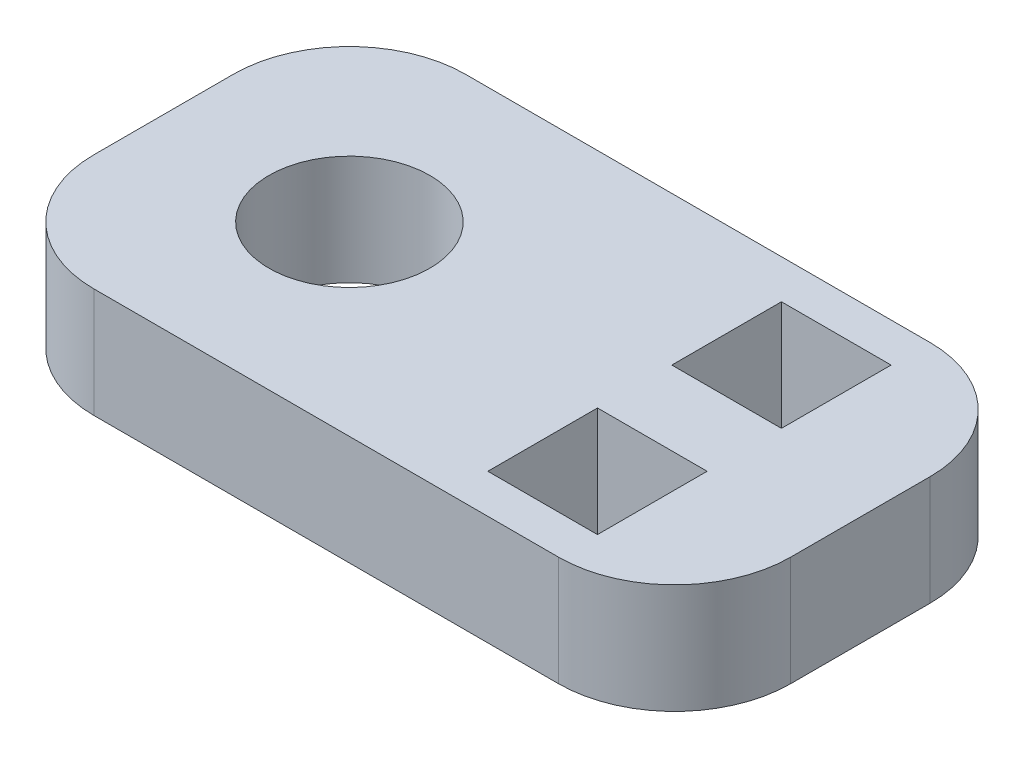
ISO-10303-21;
HEADER;
FILE_DESCRIPTION(('STEP AP214'),'2;1');
FILE_NAME('part.step','',(''),(''),'','','');
FILE_SCHEMA(('AUTOMOTIVE_DESIGN { 1 0 10303 214 1 1 1 1 }'));
ENDSEC;
DATA;
#1=APPLICATION_CONTEXT('core data for automotive mechanical design processes');
#2=APPLICATION_PROTOCOL_DEFINITION('international standard','automotive_design',2000,#1);
#3=PRODUCT_CONTEXT('',#1,'mechanical');
#4=PRODUCT('Part','Part','',(#3));
#5=PRODUCT_RELATED_PRODUCT_CATEGORY('part','',(#4));
#6=PRODUCT_DEFINITION_FORMATION('','',#4);
#7=PRODUCT_DEFINITION_CONTEXT('part definition',#1,'design');
#8=PRODUCT_DEFINITION('design','',#6,#7);
#9=PRODUCT_DEFINITION_SHAPE('','',#8);
#10=(LENGTH_UNIT() NAMED_UNIT(*) SI_UNIT(.MILLI.,.METRE.));
#11=(NAMED_UNIT(*) PLANE_ANGLE_UNIT() SI_UNIT($,.RADIAN.));
#12=(NAMED_UNIT(*) SI_UNIT($,.STERADIAN.) SOLID_ANGLE_UNIT());
#13=UNCERTAINTY_MEASURE_WITH_UNIT(LENGTH_MEASURE(1.E-05),#10,'distance_accuracy_value','');
#14=(GEOMETRIC_REPRESENTATION_CONTEXT(3) GLOBAL_UNCERTAINTY_ASSIGNED_CONTEXT((#13)) GLOBAL_UNIT_ASSIGNED_CONTEXT((#10,
#11,#12)) REPRESENTATION_CONTEXT('',''));
#15=CARTESIAN_POINT('',(0.,0.,0.));
#16=DIRECTION('',(0.,0.,1.));
#17=DIRECTION('',(1.,0.,0.));
#18=AXIS2_PLACEMENT_3D('',#15,#16,#17);
#19=CARTESIAN_POINT('',(0.,2.9972,-10.16));
#20=DIRECTION('',(0.,-1.,0.));
#21=DIRECTION('',(0.,0.,-1.));
#22=AXIS2_PLACEMENT_3D('',#19,#20,#21);
#23=PLANE('',#22);
#24=DIRECTION('',(0.,0.,1.));
#25=VECTOR('',#24,1.);
#26=CARTESIAN_POINT('',(12.8778,2.9972,-9.0932));
#27=LINE('',#26,#25);
#28=CARTESIAN_POINT('',(12.8778,2.9972,-9.0932));
#29=VERTEX_POINT('',#28);
#30=CARTESIAN_POINT('',(12.8778,2.9972,-6.096));
#31=VERTEX_POINT('',#30);
#32=EDGE_CURVE('E190',#29,#31,#27,.T.);
#33=ORIENTED_EDGE('',*,*,#32,.F.);
#34=DIRECTION('',(-1.,0.,0.));
#35=VECTOR('',#34,1.);
#36=CARTESIAN_POINT('',(12.8778,2.9972,-9.0932));
#37=LINE('',#36,#35);
#38=CARTESIAN_POINT('',(15.875,2.9972,-9.0932));
#39=VERTEX_POINT('',#38);
#40=EDGE_CURVE('E198',#39,#29,#37,.T.);
#41=ORIENTED_EDGE('',*,*,#40,.F.);
#42=DIRECTION('',(0.,0.,-1.));
#43=VECTOR('',#42,1.);
#44=CARTESIAN_POINT('',(15.875,2.9972,-9.0932));
#45=LINE('',#44,#43);
#46=CARTESIAN_POINT('',(15.875,2.9972,-6.096));
#47=VERTEX_POINT('',#46);
#48=EDGE_CURVE('E195',#47,#39,#45,.T.);
#49=ORIENTED_EDGE('',*,*,#48,.F.);
#50=DIRECTION('',(1.,0.,0.));
#51=VECTOR('',#50,1.);
#52=CARTESIAN_POINT('',(12.8778,2.9972,-6.096));
#53=LINE('',#52,#51);
#54=EDGE_CURVE('E192',#31,#47,#53,.T.);
#55=ORIENTED_EDGE('',*,*,#54,.F.);
#56=EDGE_LOOP('',(#33,#41,#49,#55));
#57=FACE_BOUND('',#56,.T.);
#58=DIRECTION('',(1.,0.,0.));
#59=VECTOR('',#58,1.);
#60=CARTESIAN_POINT('',(0.,2.9972,0.));
#61=LINE('',#60,#59);
#62=CARTESIAN_POINT('',(3.175,2.9972,0.));
#63=VERTEX_POINT('',#62);
#64=CARTESIAN_POINT('',(15.875,2.9972,0.));
#65=VERTEX_POINT('',#64);
#66=EDGE_CURVE('E230',#63,#65,#61,.T.);
#67=ORIENTED_EDGE('',*,*,#66,.T.);
#68=CARTESIAN_POINT('',(15.875,2.9972,-3.175));
#69=DIRECTION('',(0.,-1.,0.));
#70=DIRECTION('',(0.,0.,-1.));
#71=AXIS2_PLACEMENT_3D('',#68,#69,#70);
#72=CIRCLE('',#71,3.175);
#73=CARTESIAN_POINT('',(19.05,2.9972,-3.175));
#74=VERTEX_POINT('',#73);
#75=EDGE_CURVE('E270',#65,#74,#72,.F.);
#76=ORIENTED_EDGE('',*,*,#75,.T.);
#77=DIRECTION('',(0.,0.,-1.));
#78=VECTOR('',#77,1.);
#79=CARTESIAN_POINT('',(19.05,2.9972,0.));
#80=LINE('',#79,#78);
#81=CARTESIAN_POINT('',(19.05,2.9972,-6.985));
#82=VERTEX_POINT('',#81);
#83=EDGE_CURVE('E234',#74,#82,#80,.T.);
#84=ORIENTED_EDGE('',*,*,#83,.T.);
#85=CARTESIAN_POINT('',(15.875,2.9972,-6.985));
#86=DIRECTION('',(0.,-1.,0.));
#87=DIRECTION('',(0.,0.,-1.));
#88=AXIS2_PLACEMENT_3D('',#85,#86,#87);
#89=CIRCLE('',#88,3.175);
#90=CARTESIAN_POINT('',(15.875,2.9972,-10.16));
#91=VERTEX_POINT('',#90);
#92=EDGE_CURVE('E55',#82,#91,#89,.F.);
#93=ORIENTED_EDGE('',*,*,#92,.T.);
#94=DIRECTION('',(-1.,0.,0.));
#95=VECTOR('',#94,1.);
#96=CARTESIAN_POINT('',(0.,2.9972,-10.16));
#97=LINE('',#96,#95);
#98=CARTESIAN_POINT('',(3.175,2.9972,-10.16));
#99=VERTEX_POINT('',#98);
#100=EDGE_CURVE('E236',#91,#99,#97,.T.);
#101=ORIENTED_EDGE('',*,*,#100,.T.);
#102=CARTESIAN_POINT('',(3.175,2.9972,-6.985));
#103=DIRECTION('',(0.,-1.,0.));
#104=DIRECTION('',(0.,0.,-1.));
#105=AXIS2_PLACEMENT_3D('',#102,#103,#104);
#106=CIRCLE('',#105,3.175);
#107=CARTESIAN_POINT('',(0.,2.9972,-6.985));
#108=VERTEX_POINT('',#107);
#109=EDGE_CURVE('E267',#99,#108,#106,.F.);
#110=ORIENTED_EDGE('',*,*,#109,.T.);
#111=DIRECTION('',(0.,0.,1.));
#112=VECTOR('',#111,1.);
#113=CARTESIAN_POINT('',(0.,2.9972,0.));
#114=LINE('',#113,#112);
#115=CARTESIAN_POINT('',(0.,2.9972,-3.175));
#116=VERTEX_POINT('',#115);
#117=EDGE_CURVE('E227',#108,#116,#114,.T.);
#118=ORIENTED_EDGE('',*,*,#117,.T.);
#119=CARTESIAN_POINT('',(3.175,2.9972,-3.175));
#120=DIRECTION('',(0.,-1.,0.));
#121=DIRECTION('',(0.,0.,-1.));
#122=AXIS2_PLACEMENT_3D('',#119,#120,#121);
#123=CIRCLE('',#122,3.175);
#124=EDGE_CURVE('E265',#116,#63,#123,.F.);
#125=ORIENTED_EDGE('',*,*,#124,.T.);
#126=EDGE_LOOP('',(#67,#76,#84,#93,#101,#110,#118,#125));
#127=FACE_BOUND('',#126,.T.);
#128=CARTESIAN_POINT('',(5.08,2.9972,-5.08));
#129=DIRECTION('',(0.,1.,0.));
#130=DIRECTION('',(0.,0.,1.));
#131=AXIS2_PLACEMENT_3D('',#128,#129,#130);
#132=CIRCLE('',#131,2.2);
#133=CARTESIAN_POINT('',(5.08,2.9972,-7.28));
#134=VERTEX_POINT('',#133);
#135=EDGE_CURVE('E221',#134,#134,#132,.T.);
#136=ORIENTED_EDGE('',*,*,#135,.F.);
#137=EDGE_LOOP('',(#136));
#138=FACE_BOUND('',#137,.T.);
#139=DIRECTION('',(1.,0.,0.));
#140=VECTOR('',#139,1.);
#141=CARTESIAN_POINT('',(12.8778,2.9972,-1.0668));
#142=LINE('',#141,#140);
#143=CARTESIAN_POINT('',(12.8778,2.9972,-1.0668));
#144=VERTEX_POINT('',#143);
#145=CARTESIAN_POINT('',(15.875,2.9972,-1.0668));
#146=VERTEX_POINT('',#145);
#147=EDGE_CURVE('E149',#144,#146,#142,.T.);
#148=ORIENTED_EDGE('',*,*,#147,.F.);
#149=DIRECTION('',(0.,0.,1.));
#150=VECTOR('',#149,1.);
#151=CARTESIAN_POINT('',(12.8778,2.9972,-1.0668));
#152=LINE('',#151,#150);
#153=CARTESIAN_POINT('',(12.8778,2.9972,-4.064));
#154=VERTEX_POINT('',#153);
#155=EDGE_CURVE('E174',#154,#144,#152,.T.);
#156=ORIENTED_EDGE('',*,*,#155,.F.);
#157=DIRECTION('',(-1.,0.,0.));
#158=VECTOR('',#157,1.);
#159=CARTESIAN_POINT('',(12.8778,2.9972,-4.064));
#160=LINE('',#159,#158);
#161=CARTESIAN_POINT('',(15.875,2.9972,-4.064));
#162=VERTEX_POINT('',#161);
#163=EDGE_CURVE('E172',#162,#154,#160,.T.);
#164=ORIENTED_EDGE('',*,*,#163,.F.);
#165=DIRECTION('',(0.,0.,-1.));
#166=VECTOR('',#165,1.);
#167=CARTESIAN_POINT('',(15.875,2.9972,-1.0668));
#168=LINE('',#167,#166);
#169=EDGE_CURVE('E159',#146,#162,#168,.T.);
#170=ORIENTED_EDGE('',*,*,#169,.F.);
#171=EDGE_LOOP('',(#148,#156,#164,#170));
#172=FACE_BOUND('',#171,.T.);
#173=ADVANCED_FACE('F33',(#57,#127,#138,#172),#23,.F.);
#174=CARTESIAN_POINT('',(0.,0.,-10.16));
#175=DIRECTION('',(0.,-1.,0.));
#176=DIRECTION('',(0.,0.,-1.));
#177=AXIS2_PLACEMENT_3D('',#174,#175,#176);
#178=PLANE('',#177);
#179=DIRECTION('',(-1.,0.,0.));
#180=VECTOR('',#179,1.);
#181=CARTESIAN_POINT('',(12.8778,0.,-9.0932));
#182=LINE('',#181,#180);
#183=CARTESIAN_POINT('',(15.875,0.,-9.0932));
#184=VERTEX_POINT('',#183);
#185=CARTESIAN_POINT('',(12.8778,0.,-9.0932));
#186=VERTEX_POINT('',#185);
#187=EDGE_CURVE('E193',#184,#186,#182,.T.);
#188=ORIENTED_EDGE('',*,*,#187,.T.);
#189=DIRECTION('',(0.,0.,1.));
#190=VECTOR('',#189,1.);
#191=CARTESIAN_POINT('',(12.8778,0.,-9.0932));
#192=LINE('',#191,#190);
#193=CARTESIAN_POINT('',(12.8778,0.,-6.096));
#194=VERTEX_POINT('',#193);
#195=EDGE_CURVE('E167',#186,#194,#192,.T.);
#196=ORIENTED_EDGE('',*,*,#195,.T.);
#197=DIRECTION('',(1.,0.,0.));
#198=VECTOR('',#197,1.);
#199=CARTESIAN_POINT('',(12.8778,0.,-6.096));
#200=LINE('',#199,#198);
#201=CARTESIAN_POINT('',(15.875,0.,-6.096));
#202=VERTEX_POINT('',#201);
#203=EDGE_CURVE('E203',#194,#202,#200,.T.);
#204=ORIENTED_EDGE('',*,*,#203,.T.);
#205=DIRECTION('',(0.,0.,-1.));
#206=VECTOR('',#205,1.);
#207=CARTESIAN_POINT('',(15.875,0.,-9.0932));
#208=LINE('',#207,#206);
#209=EDGE_CURVE('E206',#202,#184,#208,.T.);
#210=ORIENTED_EDGE('',*,*,#209,.T.);
#211=EDGE_LOOP('',(#188,#196,#204,#210));
#212=FACE_BOUND('',#211,.T.);
#213=DIRECTION('',(0.,0.,-1.));
#214=VECTOR('',#213,1.);
#215=CARTESIAN_POINT('',(19.05,0.,0.));
#216=LINE('',#215,#214);
#217=CARTESIAN_POINT('',(19.05,0.,-3.175));
#218=VERTEX_POINT('',#217);
#219=CARTESIAN_POINT('',(19.05,0.,-6.985));
#220=VERTEX_POINT('',#219);
#221=EDGE_CURVE('E244',#218,#220,#216,.T.);
#222=ORIENTED_EDGE('',*,*,#221,.F.);
#223=CARTESIAN_POINT('',(15.875,0.,-3.175));
#224=DIRECTION('',(0.,-1.,0.));
#225=DIRECTION('',(0.,0.,-1.));
#226=AXIS2_PLACEMENT_3D('',#223,#224,#225);
#227=CIRCLE('',#226,3.175);
#228=CARTESIAN_POINT('',(15.875,0.,0.));
#229=VERTEX_POINT('',#228);
#230=EDGE_CURVE('E258',#218,#229,#227,.T.);
#231=ORIENTED_EDGE('',*,*,#230,.T.);
#232=DIRECTION('',(1.,0.,0.));
#233=VECTOR('',#232,1.);
#234=CARTESIAN_POINT('',(0.,0.,0.));
#235=LINE('',#234,#233);
#236=CARTESIAN_POINT('',(3.175,0.,0.));
#237=VERTEX_POINT('',#236);
#238=EDGE_CURVE('E241',#237,#229,#235,.T.);
#239=ORIENTED_EDGE('',*,*,#238,.F.);
#240=CARTESIAN_POINT('',(3.175,0.,-3.175));
#241=DIRECTION('',(0.,-1.,0.));
#242=DIRECTION('',(0.,0.,-1.));
#243=AXIS2_PLACEMENT_3D('',#240,#241,#242);
#244=CIRCLE('',#243,3.175);
#245=CARTESIAN_POINT('',(0.,0.,-3.175));
#246=VERTEX_POINT('',#245);
#247=EDGE_CURVE('E252',#237,#246,#244,.T.);
#248=ORIENTED_EDGE('',*,*,#247,.T.);
#249=DIRECTION('',(0.,0.,1.));
#250=VECTOR('',#249,1.);
#251=CARTESIAN_POINT('',(0.,0.,0.));
#252=LINE('',#251,#250);
#253=CARTESIAN_POINT('',(0.,0.,-6.985));
#254=VERTEX_POINT('',#253);
#255=EDGE_CURVE('E224',#254,#246,#252,.T.);
#256=ORIENTED_EDGE('',*,*,#255,.F.);
#257=CARTESIAN_POINT('',(3.175,0.,-6.985));
#258=DIRECTION('',(0.,-1.,0.));
#259=DIRECTION('',(0.,0.,-1.));
#260=AXIS2_PLACEMENT_3D('',#257,#258,#259);
#261=CIRCLE('',#260,3.175);
#262=CARTESIAN_POINT('',(3.175,0.,-10.16));
#263=VERTEX_POINT('',#262);
#264=EDGE_CURVE('E254',#254,#263,#261,.T.);
#265=ORIENTED_EDGE('',*,*,#264,.T.);
#266=DIRECTION('',(-1.,0.,0.));
#267=VECTOR('',#266,1.);
#268=CARTESIAN_POINT('',(0.,0.,-10.16));
#269=LINE('',#268,#267);
#270=CARTESIAN_POINT('',(15.875,0.,-10.16));
#271=VERTEX_POINT('',#270);
#272=EDGE_CURVE('E231',#271,#263,#269,.T.);
#273=ORIENTED_EDGE('',*,*,#272,.F.);
#274=CARTESIAN_POINT('',(15.875,0.,-6.985));
#275=DIRECTION('',(0.,-1.,0.));
#276=DIRECTION('',(0.,0.,-1.));
#277=AXIS2_PLACEMENT_3D('',#274,#275,#276);
#278=CIRCLE('',#277,3.175);
#279=EDGE_CURVE('E256',#271,#220,#278,.T.);
#280=ORIENTED_EDGE('',*,*,#279,.T.);
#281=EDGE_LOOP('',(#222,#231,#239,#248,#256,#265,#273,#280));
#282=FACE_BOUND('',#281,.T.);
#283=CARTESIAN_POINT('',(5.08,0.,-5.08));
#284=DIRECTION('',(0.,1.,0.));
#285=DIRECTION('',(0.,0.,1.));
#286=AXIS2_PLACEMENT_3D('',#283,#284,#285);
#287=CIRCLE('',#286,2.2);
#288=CARTESIAN_POINT('',(5.08,0.,-7.28));
#289=VERTEX_POINT('',#288);
#290=EDGE_CURVE('E220',#289,#289,#287,.T.);
#291=ORIENTED_EDGE('',*,*,#290,.T.);
#292=EDGE_LOOP('',(#291));
#293=FACE_BOUND('',#292,.T.);
#294=DIRECTION('',(0.,0.,1.));
#295=VECTOR('',#294,1.);
#296=CARTESIAN_POINT('',(12.8778,0.,-1.0668));
#297=LINE('',#296,#295);
#298=CARTESIAN_POINT('',(12.8778,0.,-4.064));
#299=VERTEX_POINT('',#298);
#300=CARTESIAN_POINT('',(12.8778,0.,-1.0668));
#301=VERTEX_POINT('',#300);
#302=EDGE_CURVE('E160',#299,#301,#297,.T.);
#303=ORIENTED_EDGE('',*,*,#302,.T.);
#304=DIRECTION('',(1.,0.,0.));
#305=VECTOR('',#304,1.);
#306=CARTESIAN_POINT('',(12.8778,0.,-1.0668));
#307=LINE('',#306,#305);
#308=CARTESIAN_POINT('',(15.875,0.,-1.0668));
#309=VERTEX_POINT('',#308);
#310=EDGE_CURVE('E178',#301,#309,#307,.T.);
#311=ORIENTED_EDGE('',*,*,#310,.T.);
#312=DIRECTION('',(0.,0.,-1.));
#313=VECTOR('',#312,1.);
#314=CARTESIAN_POINT('',(15.875,0.,-1.0668));
#315=LINE('',#314,#313);
#316=CARTESIAN_POINT('',(15.875,0.,-4.064));
#317=VERTEX_POINT('',#316);
#318=EDGE_CURVE('E166',#309,#317,#315,.T.);
#319=ORIENTED_EDGE('',*,*,#318,.T.);
#320=DIRECTION('',(-1.,0.,0.));
#321=VECTOR('',#320,1.);
#322=CARTESIAN_POINT('',(12.8778,0.,-4.064));
#323=LINE('',#322,#321);
#324=EDGE_CURVE('E181',#317,#299,#323,.T.);
#325=ORIENTED_EDGE('',*,*,#324,.T.);
#326=EDGE_LOOP('',(#303,#311,#319,#325));
#327=FACE_BOUND('',#326,.T.);
#328=ADVANCED_FACE('F293',(#212,#282,#293,#327),#178,.T.);
#329=CARTESIAN_POINT('',(0.,2.9972,0.));
#330=DIRECTION('',(1.,0.,0.));
#331=DIRECTION('',(0.,0.,-1.));
#332=AXIS2_PLACEMENT_3D('',#329,#330,#331);
#333=PLANE('',#332);
#334=ORIENTED_EDGE('',*,*,#117,.F.);
#335=DIRECTION('',(0.,-1.,0.));
#336=VECTOR('',#335,1.);
#337=CARTESIAN_POINT('',(0.,2.9972,-6.985));
#338=LINE('',#337,#336);
#339=EDGE_CURVE('E11',#108,#254,#338,.T.);
#340=ORIENTED_EDGE('',*,*,#339,.T.);
#341=ORIENTED_EDGE('',*,*,#255,.T.);
#342=DIRECTION('',(0.,-1.,0.));
#343=VECTOR('',#342,1.);
#344=CARTESIAN_POINT('',(0.,2.9972,-3.175));
#345=LINE('',#344,#343);
#346=EDGE_CURVE('E41',#246,#116,#345,.F.);
#347=ORIENTED_EDGE('',*,*,#346,.T.);
#348=EDGE_LOOP('',(#334,#340,#341,#347));
#349=FACE_BOUND('',#348,.T.);
#350=ADVANCED_FACE('F278',(#349),#333,.F.);
#351=CARTESIAN_POINT('',(0.,2.9972,0.));
#352=DIRECTION('',(0.,0.,-1.));
#353=DIRECTION('',(-1.,0.,0.));
#354=AXIS2_PLACEMENT_3D('',#351,#352,#353);
#355=PLANE('',#354);
#356=ORIENTED_EDGE('',*,*,#238,.T.);
#357=DIRECTION('',(0.,-1.,0.));
#358=VECTOR('',#357,1.);
#359=CARTESIAN_POINT('',(15.875,2.9972,0.));
#360=LINE('',#359,#358);
#361=EDGE_CURVE('E263',#229,#65,#360,.F.);
#362=ORIENTED_EDGE('',*,*,#361,.T.);
#363=ORIENTED_EDGE('',*,*,#66,.F.);
#364=DIRECTION('',(0.,-1.,0.));
#365=VECTOR('',#364,1.);
#366=CARTESIAN_POINT('',(3.175,2.9972,0.));
#367=LINE('',#366,#365);
#368=EDGE_CURVE('E260',#63,#237,#367,.T.);
#369=ORIENTED_EDGE('',*,*,#368,.T.);
#370=EDGE_LOOP('',(#356,#362,#363,#369));
#371=FACE_BOUND('',#370,.T.);
#372=ADVANCED_FACE('F289',(#371),#355,.F.);
#373=CARTESIAN_POINT('',(19.05,2.9972,0.));
#374=DIRECTION('',(-1.,0.,0.));
#375=DIRECTION('',(0.,0.,1.));
#376=AXIS2_PLACEMENT_3D('',#373,#374,#375);
#377=PLANE('',#376);
#378=ORIENTED_EDGE('',*,*,#83,.F.);
#379=DIRECTION('',(0.,-1.,0.));
#380=VECTOR('',#379,1.);
#381=CARTESIAN_POINT('',(19.05,2.9972,-3.175));
#382=LINE('',#381,#380);
#383=EDGE_CURVE('E249',#74,#218,#382,.T.);
#384=ORIENTED_EDGE('',*,*,#383,.T.);
#385=ORIENTED_EDGE('',*,*,#221,.T.);
#386=DIRECTION('',(0.,-1.,0.));
#387=VECTOR('',#386,1.);
#388=CARTESIAN_POINT('',(19.05,2.9972,-6.985));
#389=LINE('',#388,#387);
#390=EDGE_CURVE('E238',#220,#82,#389,.F.);
#391=ORIENTED_EDGE('',*,*,#390,.T.);
#392=EDGE_LOOP('',(#378,#384,#385,#391));
#393=FACE_BOUND('',#392,.T.);
#394=ADVANCED_FACE('F301',(#393),#377,.F.);
#395=CARTESIAN_POINT('',(0.,2.9972,-10.16));
#396=DIRECTION('',(0.,0.,1.));
#397=DIRECTION('',(1.,0.,0.));
#398=AXIS2_PLACEMENT_3D('',#395,#396,#397);
#399=PLANE('',#398);
#400=ORIENTED_EDGE('',*,*,#100,.F.);
#401=DIRECTION('',(0.,-1.,0.));
#402=VECTOR('',#401,1.);
#403=CARTESIAN_POINT('',(15.875,2.9972,-10.16));
#404=LINE('',#403,#402);
#405=EDGE_CURVE('E273',#91,#271,#404,.T.);
#406=ORIENTED_EDGE('',*,*,#405,.T.);
#407=ORIENTED_EDGE('',*,*,#272,.T.);
#408=DIRECTION('',(0.,-1.,0.));
#409=VECTOR('',#408,1.);
#410=CARTESIAN_POINT('',(3.175,2.9972,-10.16));
#411=LINE('',#410,#409);
#412=EDGE_CURVE('E48',#263,#99,#411,.F.);
#413=ORIENTED_EDGE('',*,*,#412,.T.);
#414=EDGE_LOOP('',(#400,#406,#407,#413));
#415=FACE_BOUND('',#414,.T.);
#416=ADVANCED_FACE('F307',(#415),#399,.F.);
#417=CARTESIAN_POINT('',(5.08,2.9972,-5.08));
#418=DIRECTION('',(0.,-1.,0.));
#419=DIRECTION('',(0.,0.,-1.));
#420=AXIS2_PLACEMENT_3D('',#417,#418,#419);
#421=CYLINDRICAL_SURFACE('',#420,2.2);
#422=CARTESIAN_POINT('',(5.08,2.9972,-7.28));
#423=CARTESIAN_POINT('',(5.08,2.96597916666667,-7.28));
#424=CARTESIAN_POINT('',(5.08,2.93475833333333,-7.28));
#425=CARTESIAN_POINT('',(5.08,2.87231666666667,-7.28));
#426=CARTESIAN_POINT('',(5.08,2.84109583333333,-7.28));
#427=CARTESIAN_POINT('',(5.08,2.77865416666667,-7.28));
#428=CARTESIAN_POINT('',(5.08,2.74743333333333,-7.28));
#429=CARTESIAN_POINT('',(5.08,2.68499166666667,-7.28));
#430=CARTESIAN_POINT('',(5.08,2.65377083333333,-7.28));
#431=CARTESIAN_POINT('',(5.08,2.59132916666667,-7.28));
#432=CARTESIAN_POINT('',(5.08,2.56010833333333,-7.28));
#433=CARTESIAN_POINT('',(5.08,2.49766666666667,-7.28));
#434=CARTESIAN_POINT('',(5.08,2.46644583333333,-7.28));
#435=CARTESIAN_POINT('',(5.08,2.40400416666667,-7.28));
#436=CARTESIAN_POINT('',(5.08,2.37278333333333,-7.28));
#437=CARTESIAN_POINT('',(5.08,2.31034166666667,-7.28));
#438=CARTESIAN_POINT('',(5.08,2.27912083333333,-7.28));
#439=CARTESIAN_POINT('',(5.08,2.21667916666667,-7.28));
#440=CARTESIAN_POINT('',(5.08,2.18545833333333,-7.28));
#441=CARTESIAN_POINT('',(5.08,2.12301666666667,-7.28));
#442=CARTESIAN_POINT('',(5.08,2.09179583333333,-7.28));
#443=CARTESIAN_POINT('',(5.08,2.02935416666667,-7.28));
#444=CARTESIAN_POINT('',(5.08,1.99813333333333,-7.28));
#445=CARTESIAN_POINT('',(5.08,1.93569166666667,-7.28));
#446=CARTESIAN_POINT('',(5.08,1.90447083333333,-7.28));
#447=CARTESIAN_POINT('',(5.08,1.84202916666667,-7.28));
#448=CARTESIAN_POINT('',(5.08,1.81080833333333,-7.28));
#449=CARTESIAN_POINT('',(5.08,1.74836666666667,-7.28));
#450=CARTESIAN_POINT('',(5.08,1.71714583333333,-7.28));
#451=CARTESIAN_POINT('',(5.08,1.65470416666667,-7.28));
#452=CARTESIAN_POINT('',(5.08,1.62348333333333,-7.28));
#453=CARTESIAN_POINT('',(5.08,1.56104166666667,-7.28));
#454=CARTESIAN_POINT('',(5.08,1.52982083333333,-7.28));
#455=CARTESIAN_POINT('',(5.08,1.46737916666667,-7.28));
#456=CARTESIAN_POINT('',(5.08,1.43615833333333,-7.28));
#457=CARTESIAN_POINT('',(5.08,1.37371666666667,-7.28));
#458=CARTESIAN_POINT('',(5.08,1.34249583333333,-7.28));
#459=CARTESIAN_POINT('',(5.08,1.28005416666667,-7.28));
#460=CARTESIAN_POINT('',(5.08,1.24883333333333,-7.28));
#461=CARTESIAN_POINT('',(5.08,1.18639166666667,-7.28));
#462=CARTESIAN_POINT('',(5.08,1.15517083333333,-7.28));
#463=CARTESIAN_POINT('',(5.08,1.09272916666667,-7.28));
#464=CARTESIAN_POINT('',(5.08,1.06150833333333,-7.28));
#465=CARTESIAN_POINT('',(5.08,0.999066666666667,-7.28));
#466=CARTESIAN_POINT('',(5.08,0.967845833333333,-7.28));
#467=CARTESIAN_POINT('',(5.08,0.905404166666667,-7.28));
#468=CARTESIAN_POINT('',(5.08,0.874183333333333,-7.28));
#469=CARTESIAN_POINT('',(5.08,0.811741666666667,-7.28));
#470=CARTESIAN_POINT('',(5.08,0.780520833333333,-7.28));
#471=CARTESIAN_POINT('',(5.08,0.718079166666667,-7.28));
#472=CARTESIAN_POINT('',(5.08,0.686858333333333,-7.28));
#473=CARTESIAN_POINT('',(5.08,0.624416666666667,-7.28));
#474=CARTESIAN_POINT('',(5.08,0.593195833333333,-7.28));
#475=CARTESIAN_POINT('',(5.08,0.530754166666667,-7.28));
#476=CARTESIAN_POINT('',(5.08,0.499533333333333,-7.28));
#477=CARTESIAN_POINT('',(5.08,0.437091666666667,-7.28));
#478=CARTESIAN_POINT('',(5.08,0.405870833333333,-7.28));
#479=CARTESIAN_POINT('',(5.08,0.343429166666667,-7.28));
#480=CARTESIAN_POINT('',(5.08,0.312208333333333,-7.28));
#481=CARTESIAN_POINT('',(5.08,0.249766666666667,-7.28));
#482=CARTESIAN_POINT('',(5.08,0.218545833333333,-7.28));
#483=CARTESIAN_POINT('',(5.08,0.156104166666667,-7.28));
#484=CARTESIAN_POINT('',(5.08,0.124883333333333,-7.28));
#485=CARTESIAN_POINT('',(5.08,0.0624416666666668,-7.28));
#486=CARTESIAN_POINT('',(5.08,0.0312208333333333,-7.28));
#487=CARTESIAN_POINT('',(5.08,0.,-7.28));
#488=B_SPLINE_CURVE_WITH_KNOTS('',3,(#422,#423,#424,#425,#426,#427,#428,#429,#430,#431,#432,
#433,#434,#435,#436,#437,#438,#439,#440,#441,#442,#443,#444,#445,#446,#447,#448,#449,#450,#451,
#452,#453,#454,#455,#456,#457,#458,#459,#460,#461,#462,#463,#464,#465,#466,#467,#468,#469,#470,
#471,#472,#473,#474,#475,#476,#477,#478,#479,#480,#481,#482,#483,#484,#485,#486,#487),
.UNSPECIFIED.,.F.,.F.,(4,2,2,2,2,2,2,2,2,2,2,2,2,2,2,2,2,2,2,2,2,2,2,2,2,2,2,2,2,2,2,2,4),(0.,
0.0936625000000002,0.187325,0.2809875,0.37465,0.4683125,0.561975,0.6556375,0.7493,0.8429625,
0.936625,1.0302875,1.12395,1.2176125,1.311275,1.4049375,1.4986,1.5922625,1.685925,1.7795875,
1.87325,1.9669125,2.060575,2.1542375,2.2479,2.3415625,2.435225,2.5288875,2.62255,2.7162125,
2.809875,2.9035375,2.9972),.UNSPECIFIED.);
#489=EDGE_CURVE('BSEAM326',#134,#289,#488,.T.);
#490=ORIENTED_EDGE('',*,*,#135,.T.);
#491=ORIENTED_EDGE('',*,*,#290,.F.);
#492=ORIENTED_EDGE('',*,*,#489,.T.);
#493=ORIENTED_EDGE('',*,*,#489,.F.);
#494=EDGE_LOOP('',(#490,#492,#491,#493));
#495=FACE_BOUND('',#494,.T.);
#496=ADVANCED_FACE('F326',(#495),#421,.F.);
#497=CARTESIAN_POINT('',(12.8778,2.9972,-9.0932));
#498=DIRECTION('',(1.,0.,0.));
#499=DIRECTION('',(0.,0.,-1.));
#500=AXIS2_PLACEMENT_3D('',#497,#498,#499);
#501=PLANE('',#500);
#502=ORIENTED_EDGE('',*,*,#195,.F.);
#503=DIRECTION('',(0.,-1.,0.));
#504=VECTOR('',#503,1.);
#505=CARTESIAN_POINT('',(12.8778,2.9972,-9.0932));
#506=LINE('',#505,#504);
#507=EDGE_CURVE('E200',#29,#186,#506,.T.);
#508=ORIENTED_EDGE('',*,*,#507,.F.);
#509=ORIENTED_EDGE('',*,*,#32,.T.);
#510=DIRECTION('',(0.,-1.,0.));
#511=VECTOR('',#510,1.);
#512=CARTESIAN_POINT('',(12.8778,2.9972,-6.096));
#513=LINE('',#512,#511);
#514=EDGE_CURVE('E217',#31,#194,#513,.T.);
#515=ORIENTED_EDGE('',*,*,#514,.T.);
#516=EDGE_LOOP('',(#502,#508,#509,#515));
#517=FACE_BOUND('',#516,.T.);
#518=ADVANCED_FACE('F366',(#517),#501,.T.);
#519=CARTESIAN_POINT('',(12.8778,2.9972,-6.096));
#520=DIRECTION('',(0.,0.,-1.));
#521=DIRECTION('',(-1.,0.,0.));
#522=AXIS2_PLACEMENT_3D('',#519,#520,#521);
#523=PLANE('',#522);
#524=ORIENTED_EDGE('',*,*,#203,.F.);
#525=ORIENTED_EDGE('',*,*,#514,.F.);
#526=ORIENTED_EDGE('',*,*,#54,.T.);
#527=DIRECTION('',(0.,-1.,0.));
#528=VECTOR('',#527,1.);
#529=CARTESIAN_POINT('',(15.875,2.9972,-6.096));
#530=LINE('',#529,#528);
#531=EDGE_CURVE('E215',#47,#202,#530,.T.);
#532=ORIENTED_EDGE('',*,*,#531,.T.);
#533=EDGE_LOOP('',(#524,#525,#526,#532));
#534=FACE_BOUND('',#533,.T.);
#535=ADVANCED_FACE('F363',(#534),#523,.T.);
#536=CARTESIAN_POINT('',(15.875,2.9972,-9.0932));
#537=DIRECTION('',(-1.,0.,0.));
#538=DIRECTION('',(0.,0.,1.));
#539=AXIS2_PLACEMENT_3D('',#536,#537,#538);
#540=PLANE('',#539);
#541=ORIENTED_EDGE('',*,*,#209,.F.);
#542=ORIENTED_EDGE('',*,*,#531,.F.);
#543=ORIENTED_EDGE('',*,*,#48,.T.);
#544=DIRECTION('',(0.,-1.,0.));
#545=VECTOR('',#544,1.);
#546=CARTESIAN_POINT('',(15.875,2.9972,-9.0932));
#547=LINE('',#546,#545);
#548=EDGE_CURVE('E213',#39,#184,#547,.T.);
#549=ORIENTED_EDGE('',*,*,#548,.T.);
#550=EDGE_LOOP('',(#541,#542,#543,#549));
#551=FACE_BOUND('',#550,.T.);
#552=ADVANCED_FACE('F359',(#551),#540,.T.);
#553=CARTESIAN_POINT('',(12.8778,2.9972,-9.0932));
#554=DIRECTION('',(0.,0.,1.));
#555=DIRECTION('',(1.,0.,0.));
#556=AXIS2_PLACEMENT_3D('',#553,#554,#555);
#557=PLANE('',#556);
#558=ORIENTED_EDGE('',*,*,#187,.F.);
#559=ORIENTED_EDGE('',*,*,#548,.F.);
#560=ORIENTED_EDGE('',*,*,#40,.T.);
#561=ORIENTED_EDGE('',*,*,#507,.T.);
#562=EDGE_LOOP('',(#558,#559,#560,#561));
#563=FACE_BOUND('',#562,.T.);
#564=ADVANCED_FACE('F356',(#563),#557,.T.);
#565=CARTESIAN_POINT('',(12.8778,2.9972,-1.0668));
#566=DIRECTION('',(0.,0.,-1.));
#567=DIRECTION('',(-1.,0.,0.));
#568=AXIS2_PLACEMENT_3D('',#565,#566,#567);
#569=PLANE('',#568);
#570=ORIENTED_EDGE('',*,*,#310,.F.);
#571=DIRECTION('',(0.,-1.,0.));
#572=VECTOR('',#571,1.);
#573=CARTESIAN_POINT('',(12.8778,2.9972,-1.0668));
#574=LINE('',#573,#572);
#575=EDGE_CURVE('E155',#144,#301,#574,.T.);
#576=ORIENTED_EDGE('',*,*,#575,.F.);
#577=ORIENTED_EDGE('',*,*,#147,.T.);
#578=DIRECTION('',(0.,-1.,0.));
#579=VECTOR('',#578,1.);
#580=CARTESIAN_POINT('',(15.875,2.9972,-1.0668));
#581=LINE('',#580,#579);
#582=EDGE_CURVE('E152',#146,#309,#581,.T.);
#583=ORIENTED_EDGE('',*,*,#582,.T.);
#584=EDGE_LOOP('',(#570,#576,#577,#583));
#585=FACE_BOUND('',#584,.T.);
#586=ADVANCED_FACE('F151',(#585),#569,.T.);
#587=CARTESIAN_POINT('',(15.875,2.9972,-1.0668));
#588=DIRECTION('',(-1.,0.,0.));
#589=DIRECTION('',(0.,0.,1.));
#590=AXIS2_PLACEMENT_3D('',#587,#588,#589);
#591=PLANE('',#590);
#592=ORIENTED_EDGE('',*,*,#318,.F.);
#593=ORIENTED_EDGE('',*,*,#582,.F.);
#594=ORIENTED_EDGE('',*,*,#169,.T.);
#595=DIRECTION('',(0.,-1.,0.));
#596=VECTOR('',#595,1.);
#597=CARTESIAN_POINT('',(15.875,2.9972,-4.064));
#598=LINE('',#597,#596);
#599=EDGE_CURVE('E168',#162,#317,#598,.T.);
#600=ORIENTED_EDGE('',*,*,#599,.T.);
#601=EDGE_LOOP('',(#592,#593,#594,#600));
#602=FACE_BOUND('',#601,.T.);
#603=ADVANCED_FACE('F163',(#602),#591,.T.);
#604=CARTESIAN_POINT('',(12.8778,2.9972,-4.064));
#605=DIRECTION('',(0.,0.,1.));
#606=DIRECTION('',(1.,0.,0.));
#607=AXIS2_PLACEMENT_3D('',#604,#605,#606);
#608=PLANE('',#607);
#609=ORIENTED_EDGE('',*,*,#324,.F.);
#610=ORIENTED_EDGE('',*,*,#599,.F.);
#611=ORIENTED_EDGE('',*,*,#163,.T.);
#612=DIRECTION('',(0.,-1.,0.));
#613=VECTOR('',#612,1.);
#614=CARTESIAN_POINT('',(12.8778,2.9972,-4.064));
#615=LINE('',#614,#613);
#616=EDGE_CURVE('E187',#154,#299,#615,.T.);
#617=ORIENTED_EDGE('',*,*,#616,.T.);
#618=EDGE_LOOP('',(#609,#610,#611,#617));
#619=FACE_BOUND('',#618,.T.);
#620=ADVANCED_FACE('F342',(#619),#608,.T.);
#621=CARTESIAN_POINT('',(12.8778,2.9972,-1.0668));
#622=DIRECTION('',(1.,0.,0.));
#623=DIRECTION('',(0.,0.,-1.));
#624=AXIS2_PLACEMENT_3D('',#621,#622,#623);
#625=PLANE('',#624);
#626=ORIENTED_EDGE('',*,*,#302,.F.);
#627=ORIENTED_EDGE('',*,*,#616,.F.);
#628=ORIENTED_EDGE('',*,*,#155,.T.);
#629=ORIENTED_EDGE('',*,*,#575,.T.);
#630=EDGE_LOOP('',(#626,#627,#628,#629));
#631=FACE_BOUND('',#630,.T.);
#632=ADVANCED_FACE('F338',(#631),#625,.T.);
#633=CARTESIAN_POINT('',(15.875,2.9972,-3.175));
#634=DIRECTION('',(0.,-1.,0.));
#635=DIRECTION('',(0.,0.,-1.));
#636=AXIS2_PLACEMENT_3D('',#633,#634,#635);
#637=CYLINDRICAL_SURFACE('',#636,3.175);
#638=ORIENTED_EDGE('',*,*,#75,.F.);
#639=ORIENTED_EDGE('',*,*,#361,.F.);
#640=ORIENTED_EDGE('',*,*,#230,.F.);
#641=ORIENTED_EDGE('',*,*,#383,.F.);
#642=EDGE_LOOP('',(#638,#639,#640,#641));
#643=FACE_BOUND('',#642,.T.);
#644=ADVANCED_FACE('F298',(#643),#637,.T.);
#645=CARTESIAN_POINT('',(15.875,2.9972,-6.985));
#646=DIRECTION('',(0.,-1.,0.));
#647=DIRECTION('',(0.,0.,-1.));
#648=AXIS2_PLACEMENT_3D('',#645,#646,#647);
#649=CYLINDRICAL_SURFACE('',#648,3.175);
#650=ORIENTED_EDGE('',*,*,#92,.F.);
#651=ORIENTED_EDGE('',*,*,#390,.F.);
#652=ORIENTED_EDGE('',*,*,#279,.F.);
#653=ORIENTED_EDGE('',*,*,#405,.F.);
#654=EDGE_LOOP('',(#650,#651,#652,#653));
#655=FACE_BOUND('',#654,.T.);
#656=ADVANCED_FACE('F305',(#655),#649,.T.);
#657=CARTESIAN_POINT('',(3.175,2.9972,-6.985));
#658=DIRECTION('',(0.,-1.,0.));
#659=DIRECTION('',(0.,0.,-1.));
#660=AXIS2_PLACEMENT_3D('',#657,#658,#659);
#661=CYLINDRICAL_SURFACE('',#660,3.175);
#662=ORIENTED_EDGE('',*,*,#109,.F.);
#663=ORIENTED_EDGE('',*,*,#412,.F.);
#664=ORIENTED_EDGE('',*,*,#264,.F.);
#665=ORIENTED_EDGE('',*,*,#339,.F.);
#666=EDGE_LOOP('',(#662,#663,#664,#665));
#667=FACE_BOUND('',#666,.T.);
#668=ADVANCED_FACE('F309',(#667),#661,.T.);
#669=CARTESIAN_POINT('',(3.175,2.9972,-3.175));
#670=DIRECTION('',(0.,-1.,0.));
#671=DIRECTION('',(0.,0.,-1.));
#672=AXIS2_PLACEMENT_3D('',#669,#670,#671);
#673=CYLINDRICAL_SURFACE('',#672,3.175);
#674=ORIENTED_EDGE('',*,*,#124,.F.);
#675=ORIENTED_EDGE('',*,*,#346,.F.);
#676=ORIENTED_EDGE('',*,*,#247,.F.);
#677=ORIENTED_EDGE('',*,*,#368,.F.);
#678=EDGE_LOOP('',(#674,#675,#676,#677));
#679=FACE_BOUND('',#678,.T.);
#680=ADVANCED_FACE('F35',(#679),#673,.T.);
#681=CLOSED_SHELL('',(#173,#328,#350,#372,#394,#416,#496,#518,#535,#552,#564,#586,#603,#620,
#632,#644,#656,#668,#680));
#682=MANIFOLD_SOLID_BREP('B2',#681);
#683=ADVANCED_BREP_SHAPE_REPRESENTATION('',(#18,#682),#14);
#684=SHAPE_DEFINITION_REPRESENTATION(#9,#683);
ENDSEC;
END-ISO-10303-21;
